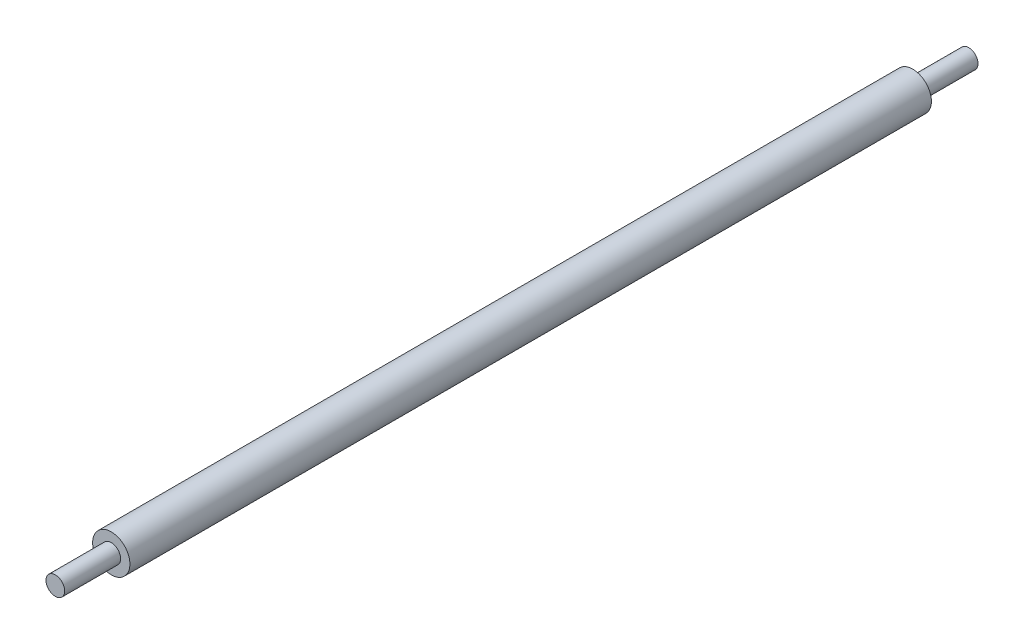
ISO-10303-21;
HEADER;
FILE_DESCRIPTION(('STEP AP214'),'2;1');
FILE_NAME('part.step','',(''),(''),'','','');
FILE_SCHEMA(('AUTOMOTIVE_DESIGN { 1 0 10303 214 1 1 1 1 }'));
ENDSEC;
DATA;
#1=APPLICATION_CONTEXT('core data for automotive mechanical design processes');
#2=APPLICATION_PROTOCOL_DEFINITION('international standard','automotive_design',2000,#1);
#3=PRODUCT_CONTEXT('',#1,'mechanical');
#4=PRODUCT('Part','Part','',(#3));
#5=PRODUCT_RELATED_PRODUCT_CATEGORY('part','',(#4));
#6=PRODUCT_DEFINITION_FORMATION('','',#4);
#7=PRODUCT_DEFINITION_CONTEXT('part definition',#1,'design');
#8=PRODUCT_DEFINITION('design','',#6,#7);
#9=PRODUCT_DEFINITION_SHAPE('','',#8);
#10=(LENGTH_UNIT() NAMED_UNIT(*) SI_UNIT(.MILLI.,.METRE.));
#11=(NAMED_UNIT(*) PLANE_ANGLE_UNIT() SI_UNIT($,.RADIAN.));
#12=(NAMED_UNIT(*) SI_UNIT($,.STERADIAN.) SOLID_ANGLE_UNIT());
#13=UNCERTAINTY_MEASURE_WITH_UNIT(LENGTH_MEASURE(1.E-05),#10,'distance_accuracy_value','');
#14=(GEOMETRIC_REPRESENTATION_CONTEXT(3) GLOBAL_UNCERTAINTY_ASSIGNED_CONTEXT((#13)) GLOBAL_UNIT_ASSIGNED_CONTEXT((#10,
#11,#12)) REPRESENTATION_CONTEXT('',''));
#15=CARTESIAN_POINT('',(0.,0.,0.));
#16=DIRECTION('',(0.,0.,1.));
#17=DIRECTION('',(1.,0.,0.));
#18=AXIS2_PLACEMENT_3D('',#15,#16,#17);
#19=CARTESIAN_POINT('',(0.,0.,622.3));
#20=DIRECTION('',(0.,0.,-1.));
#21=DIRECTION('',(-1.,0.,0.));
#22=AXIS2_PLACEMENT_3D('',#19,#20,#21);
#23=CYLINDRICAL_SURFACE('',#22,12.7);
#24=CARTESIAN_POINT('',(0.,0.,38.1));
#25=DIRECTION('',(0.,0.,1.));
#26=DIRECTION('',(1.,0.,0.));
#27=AXIS2_PLACEMENT_3D('',#24,#25,#26);
#28=CIRCLE('',#27,12.7);
#29=CARTESIAN_POINT('',(12.7,0.,38.1));
#30=VERTEX_POINT('',#29);
#31=EDGE_CURVE('E12',#30,#30,#28,.T.);
#32=ORIENTED_EDGE('',*,*,#31,.T.);
#33=EDGE_LOOP('',(#32));
#34=FACE_BOUND('',#33,.T.);
#35=CARTESIAN_POINT('',(0.,0.,584.2));
#36=DIRECTION('',(0.,0.,1.));
#37=DIRECTION('',(1.,0.,0.));
#38=AXIS2_PLACEMENT_3D('',#35,#36,#37);
#39=CIRCLE('',#38,12.7);
#40=CARTESIAN_POINT('',(12.7,0.,584.2));
#41=VERTEX_POINT('',#40);
#42=EDGE_CURVE('E51',#41,#41,#39,.T.);
#43=ORIENTED_EDGE('',*,*,#42,.F.);
#44=EDGE_LOOP('',(#43));
#45=FACE_BOUND('',#44,.T.);
#46=ADVANCED_FACE('F48',(#34,#45),#23,.T.);
#47=CARTESIAN_POINT('',(0.,0.,38.1));
#48=DIRECTION('',(0.,0.,1.));
#49=DIRECTION('',(1.,0.,0.));
#50=AXIS2_PLACEMENT_3D('',#47,#48,#49);
#51=PLANE('',#50);
#52=CARTESIAN_POINT('',(0.,0.,38.1));
#53=DIRECTION('',(0.,0.,1.));
#54=DIRECTION('',(1.,0.,0.));
#55=AXIS2_PLACEMENT_3D('',#52,#53,#54);
#56=CIRCLE('',#55,6.36193552466987);
#57=CARTESIAN_POINT('',(-6.36193552466987,0.,38.1));
#58=VERTEX_POINT('',#57);
#59=EDGE_CURVE('E55',#58,#58,#56,.T.);
#60=ORIENTED_EDGE('',*,*,#59,.T.);
#61=EDGE_LOOP('',(#60));
#62=FACE_BOUND('',#61,.T.);
#63=ORIENTED_EDGE('',*,*,#31,.F.);
#64=EDGE_LOOP('',(#63));
#65=FACE_BOUND('',#64,.T.);
#66=ADVANCED_FACE('F77',(#62,#65),#51,.F.);
#67=CARTESIAN_POINT('',(0.,0.,38.1));
#68=DIRECTION('',(0.,0.,-1.));
#69=DIRECTION('',(-1.,0.,0.));
#70=AXIS2_PLACEMENT_3D('',#67,#68,#69);
#71=CYLINDRICAL_SURFACE('',#70,6.36193552466987);
#72=CARTESIAN_POINT('',(0.,0.,0.));
#73=DIRECTION('',(0.,0.,1.));
#74=DIRECTION('',(1.,0.,0.));
#75=AXIS2_PLACEMENT_3D('',#72,#73,#74);
#76=CIRCLE('',#75,6.36193552466987);
#77=CARTESIAN_POINT('',(-6.36193552466987,0.,0.));
#78=VERTEX_POINT('',#77);
#79=EDGE_CURVE('E59',#78,#78,#76,.T.);
#80=CARTESIAN_POINT('',(-6.36193552466987,0.,38.1));
#81=CARTESIAN_POINT('',(-6.36193552466987,0.,37.703125));
#82=CARTESIAN_POINT('',(-6.36193552466987,0.,37.30625));
#83=CARTESIAN_POINT('',(-6.36193552466987,0.,36.5125));
#84=CARTESIAN_POINT('',(-6.36193552466987,0.,36.115625));
#85=CARTESIAN_POINT('',(-6.36193552466987,0.,35.321875));
#86=CARTESIAN_POINT('',(-6.36193552466987,0.,34.925));
#87=CARTESIAN_POINT('',(-6.36193552466987,0.,34.13125));
#88=CARTESIAN_POINT('',(-6.36193552466987,0.,33.734375));
#89=CARTESIAN_POINT('',(-6.36193552466987,0.,32.940625));
#90=CARTESIAN_POINT('',(-6.36193552466987,0.,32.54375));
#91=CARTESIAN_POINT('',(-6.36193552466987,0.,31.75));
#92=CARTESIAN_POINT('',(-6.36193552466987,0.,31.353125));
#93=CARTESIAN_POINT('',(-6.36193552466987,0.,30.559375));
#94=CARTESIAN_POINT('',(-6.36193552466987,0.,30.1625));
#95=CARTESIAN_POINT('',(-6.36193552466987,0.,29.36875));
#96=CARTESIAN_POINT('',(-6.36193552466987,0.,28.971875));
#97=CARTESIAN_POINT('',(-6.36193552466987,0.,28.178125));
#98=CARTESIAN_POINT('',(-6.36193552466987,0.,27.78125));
#99=CARTESIAN_POINT('',(-6.36193552466987,0.,26.9875));
#100=CARTESIAN_POINT('',(-6.36193552466987,0.,26.590625));
#101=CARTESIAN_POINT('',(-6.36193552466987,0.,25.796875));
#102=CARTESIAN_POINT('',(-6.36193552466987,0.,25.4));
#103=CARTESIAN_POINT('',(-6.36193552466987,0.,24.60625));
#104=CARTESIAN_POINT('',(-6.36193552466987,0.,24.209375));
#105=CARTESIAN_POINT('',(-6.36193552466987,0.,23.415625));
#106=CARTESIAN_POINT('',(-6.36193552466987,0.,23.01875));
#107=CARTESIAN_POINT('',(-6.36193552466987,0.,22.225));
#108=CARTESIAN_POINT('',(-6.36193552466987,0.,21.828125));
#109=CARTESIAN_POINT('',(-6.36193552466987,0.,21.034375));
#110=CARTESIAN_POINT('',(-6.36193552466987,0.,20.6375));
#111=CARTESIAN_POINT('',(-6.36193552466987,0.,19.84375));
#112=CARTESIAN_POINT('',(-6.36193552466987,0.,19.446875));
#113=CARTESIAN_POINT('',(-6.36193552466987,0.,18.653125));
#114=CARTESIAN_POINT('',(-6.36193552466987,0.,18.25625));
#115=CARTESIAN_POINT('',(-6.36193552466987,0.,17.4625));
#116=CARTESIAN_POINT('',(-6.36193552466987,0.,17.065625));
#117=CARTESIAN_POINT('',(-6.36193552466987,0.,16.271875));
#118=CARTESIAN_POINT('',(-6.36193552466987,0.,15.875));
#119=CARTESIAN_POINT('',(-6.36193552466987,0.,15.08125));
#120=CARTESIAN_POINT('',(-6.36193552466987,0.,14.684375));
#121=CARTESIAN_POINT('',(-6.36193552466987,0.,13.890625));
#122=CARTESIAN_POINT('',(-6.36193552466987,0.,13.49375));
#123=CARTESIAN_POINT('',(-6.36193552466987,0.,12.7));
#124=CARTESIAN_POINT('',(-6.36193552466987,0.,12.303125));
#125=CARTESIAN_POINT('',(-6.36193552466987,0.,11.509375));
#126=CARTESIAN_POINT('',(-6.36193552466987,0.,11.1125));
#127=CARTESIAN_POINT('',(-6.36193552466987,0.,10.31875));
#128=CARTESIAN_POINT('',(-6.36193552466987,0.,9.92187499999999));
#129=CARTESIAN_POINT('',(-6.36193552466987,0.,9.128125));
#130=CARTESIAN_POINT('',(-6.36193552466987,0.,8.73124999999999));
#131=CARTESIAN_POINT('',(-6.36193552466987,0.,7.93749999999999));
#132=CARTESIAN_POINT('',(-6.36193552466987,0.,7.54062499999999));
#133=CARTESIAN_POINT('',(-6.36193552466987,0.,6.746875));
#134=CARTESIAN_POINT('',(-6.36193552466987,0.,6.35));
#135=CARTESIAN_POINT('',(-6.36193552466987,0.,5.55625));
#136=CARTESIAN_POINT('',(-6.36193552466987,0.,5.159375));
#137=CARTESIAN_POINT('',(-6.36193552466987,0.,4.365625));
#138=CARTESIAN_POINT('',(-6.36193552466987,0.,3.96875));
#139=CARTESIAN_POINT('',(-6.36193552466987,0.,3.175));
#140=CARTESIAN_POINT('',(-6.36193552466987,0.,2.778125));
#141=CARTESIAN_POINT('',(-6.36193552466987,0.,1.984375));
#142=CARTESIAN_POINT('',(-6.36193552466987,0.,1.5875));
#143=CARTESIAN_POINT('',(-6.36193552466987,0.,0.79375));
#144=CARTESIAN_POINT('',(-6.36193552466987,0.,0.396875));
#145=CARTESIAN_POINT('',(-6.36193552466987,0.,0.));
#146=B_SPLINE_CURVE_WITH_KNOTS('',3,(#80,#81,#82,#83,#84,#85,#86,#87,#88,#89,#90,#91,#92,#93,
#94,#95,#96,#97,#98,#99,#100,#101,#102,#103,#104,#105,#106,#107,#108,#109,#110,#111,#112,#113,
#114,#115,#116,#117,#118,#119,#120,#121,#122,#123,#124,#125,#126,#127,#128,#129,#130,#131,#132,
#133,#134,#135,#136,#137,#138,#139,#140,#141,#142,#143,#144,#145),.UNSPECIFIED.,.F.,.F.,(4,2,2,
2,2,2,2,2,2,2,2,2,2,2,2,2,2,2,2,2,2,2,2,2,2,2,2,2,2,2,2,2,4),(0.,1.190625,2.38125,3.571875,
4.7625,5.953125,7.14375,8.334375,9.52500000000001,10.715625,11.90625,13.096875,14.2875,
15.478125,16.66875,17.859375,19.05,20.240625,21.43125,22.621875,23.8125,25.003125,26.19375,
27.384375,28.575,29.765625,30.95625,32.146875,33.3375,34.528125,35.71875,36.909375,38.1),.UNSPECIFIED.);
#147=EDGE_CURVE('BSEAM81',#58,#78,#146,.T.);
#148=ORIENTED_EDGE('',*,*,#59,.F.);
#149=ORIENTED_EDGE('',*,*,#79,.T.);
#150=ORIENTED_EDGE('',*,*,#147,.T.);
#151=ORIENTED_EDGE('',*,*,#147,.F.);
#152=EDGE_LOOP('',(#148,#150,#149,#151));
#153=FACE_BOUND('',#152,.T.);
#154=ADVANCED_FACE('F81',(#153),#71,.T.);
#155=CARTESIAN_POINT('',(0.,0.,0.));
#156=DIRECTION('',(0.,0.,1.));
#157=DIRECTION('',(1.,0.,0.));
#158=AXIS2_PLACEMENT_3D('',#155,#156,#157);
#159=PLANE('',#158);
#160=ORIENTED_EDGE('',*,*,#79,.F.);
#161=EDGE_LOOP('',(#160));
#162=FACE_BOUND('',#161,.T.);
#163=ADVANCED_FACE('F87',(#162),#159,.F.);
#164=CARTESIAN_POINT('',(0.,0.,584.2));
#165=DIRECTION('',(0.,0.,1.));
#166=DIRECTION('',(1.,0.,0.));
#167=AXIS2_PLACEMENT_3D('',#164,#165,#166);
#168=PLANE('',#167);
#169=CARTESIAN_POINT('',(0.,0.,584.2));
#170=DIRECTION('',(0.,0.,1.));
#171=DIRECTION('',(1.,0.,0.));
#172=AXIS2_PLACEMENT_3D('',#169,#170,#171);
#173=CIRCLE('',#172,6.37790763137687);
#174=CARTESIAN_POINT('',(6.37790763137687,0.,584.2));
#175=VERTEX_POINT('',#174);
#176=EDGE_CURVE('E67',#175,#175,#173,.T.);
#177=ORIENTED_EDGE('',*,*,#176,.F.);
#178=EDGE_LOOP('',(#177));
#179=FACE_BOUND('',#178,.T.);
#180=ORIENTED_EDGE('',*,*,#42,.T.);
#181=EDGE_LOOP('',(#180));
#182=FACE_BOUND('',#181,.T.);
#183=ADVANCED_FACE('F74',(#179,#182),#168,.T.);
#184=CARTESIAN_POINT('',(0.,0.,584.2));
#185=DIRECTION('',(0.,0.,1.));
#186=DIRECTION('',(1.,0.,0.));
#187=AXIS2_PLACEMENT_3D('',#184,#185,#186);
#188=CYLINDRICAL_SURFACE('',#187,6.37790763137687);
#189=CARTESIAN_POINT('',(0.,0.,622.3));
#190=DIRECTION('',(0.,0.,1.));
#191=DIRECTION('',(1.,0.,0.));
#192=AXIS2_PLACEMENT_3D('',#189,#190,#191);
#193=CIRCLE('',#192,6.37790763137687);
#194=CARTESIAN_POINT('',(6.37790763137687,0.,622.3));
#195=VERTEX_POINT('',#194);
#196=EDGE_CURVE('E64',#195,#195,#193,.T.);
#197=CARTESIAN_POINT('',(6.37790763137687,0.,584.2));
#198=CARTESIAN_POINT('',(6.37790763137687,0.,584.596875));
#199=CARTESIAN_POINT('',(6.37790763137687,0.,584.99375));
#200=CARTESIAN_POINT('',(6.37790763137687,0.,585.7875));
#201=CARTESIAN_POINT('',(6.37790763137687,0.,586.184375));
#202=CARTESIAN_POINT('',(6.37790763137687,0.,586.978125));
#203=CARTESIAN_POINT('',(6.37790763137687,0.,587.375));
#204=CARTESIAN_POINT('',(6.37790763137687,0.,588.16875));
#205=CARTESIAN_POINT('',(6.37790763137687,0.,588.565625));
#206=CARTESIAN_POINT('',(6.37790763137687,0.,589.359375));
#207=CARTESIAN_POINT('',(6.37790763137687,0.,589.75625));
#208=CARTESIAN_POINT('',(6.37790763137687,0.,590.55));
#209=CARTESIAN_POINT('',(6.37790763137687,0.,590.946875));
#210=CARTESIAN_POINT('',(6.37790763137687,0.,591.740625));
#211=CARTESIAN_POINT('',(6.37790763137687,0.,592.1375));
#212=CARTESIAN_POINT('',(6.37790763137687,0.,592.93125));
#213=CARTESIAN_POINT('',(6.37790763137687,0.,593.328125));
#214=CARTESIAN_POINT('',(6.37790763137687,0.,594.121875));
#215=CARTESIAN_POINT('',(6.37790763137687,0.,594.51875));
#216=CARTESIAN_POINT('',(6.37790763137687,0.,595.3125));
#217=CARTESIAN_POINT('',(6.37790763137687,0.,595.709375));
#218=CARTESIAN_POINT('',(6.37790763137687,0.,596.503125));
#219=CARTESIAN_POINT('',(6.37790763137687,0.,596.9));
#220=CARTESIAN_POINT('',(6.37790763137687,0.,597.69375));
#221=CARTESIAN_POINT('',(6.37790763137687,0.,598.090625));
#222=CARTESIAN_POINT('',(6.37790763137687,0.,598.884375));
#223=CARTESIAN_POINT('',(6.37790763137687,0.,599.28125));
#224=CARTESIAN_POINT('',(6.37790763137687,0.,600.075));
#225=CARTESIAN_POINT('',(6.37790763137687,0.,600.471875));
#226=CARTESIAN_POINT('',(6.37790763137687,0.,601.265625));
#227=CARTESIAN_POINT('',(6.37790763137687,0.,601.6625));
#228=CARTESIAN_POINT('',(6.37790763137687,0.,602.45625));
#229=CARTESIAN_POINT('',(6.37790763137687,0.,602.853125));
#230=CARTESIAN_POINT('',(6.37790763137687,0.,603.646875));
#231=CARTESIAN_POINT('',(6.37790763137687,0.,604.04375));
#232=CARTESIAN_POINT('',(6.37790763137687,0.,604.8375));
#233=CARTESIAN_POINT('',(6.37790763137687,0.,605.234375));
#234=CARTESIAN_POINT('',(6.37790763137687,0.,606.028125));
#235=CARTESIAN_POINT('',(6.37790763137687,0.,606.425));
#236=CARTESIAN_POINT('',(6.37790763137687,0.,607.21875));
#237=CARTESIAN_POINT('',(6.37790763137687,0.,607.615625));
#238=CARTESIAN_POINT('',(6.37790763137687,0.,608.409375));
#239=CARTESIAN_POINT('',(6.37790763137687,0.,608.80625));
#240=CARTESIAN_POINT('',(6.37790763137687,0.,609.6));
#241=CARTESIAN_POINT('',(6.37790763137687,0.,609.996875));
#242=CARTESIAN_POINT('',(6.37790763137687,0.,610.790625));
#243=CARTESIAN_POINT('',(6.37790763137687,0.,611.1875));
#244=CARTESIAN_POINT('',(6.37790763137687,0.,611.98125));
#245=CARTESIAN_POINT('',(6.37790763137687,0.,612.378125));
#246=CARTESIAN_POINT('',(6.37790763137687,0.,613.171875));
#247=CARTESIAN_POINT('',(6.37790763137687,0.,613.56875));
#248=CARTESIAN_POINT('',(6.37790763137687,0.,614.3625));
#249=CARTESIAN_POINT('',(6.37790763137687,0.,614.759375));
#250=CARTESIAN_POINT('',(6.37790763137687,0.,615.553125));
#251=CARTESIAN_POINT('',(6.37790763137687,0.,615.95));
#252=CARTESIAN_POINT('',(6.37790763137687,0.,616.74375));
#253=CARTESIAN_POINT('',(6.37790763137687,0.,617.140625));
#254=CARTESIAN_POINT('',(6.37790763137687,0.,617.934375));
#255=CARTESIAN_POINT('',(6.37790763137687,0.,618.33125));
#256=CARTESIAN_POINT('',(6.37790763137687,0.,619.125));
#257=CARTESIAN_POINT('',(6.37790763137687,0.,619.521875));
#258=CARTESIAN_POINT('',(6.37790763137687,0.,620.315625));
#259=CARTESIAN_POINT('',(6.37790763137687,0.,620.7125));
#260=CARTESIAN_POINT('',(6.37790763137687,0.,621.50625));
#261=CARTESIAN_POINT('',(6.37790763137687,0.,621.903125));
#262=CARTESIAN_POINT('',(6.37790763137687,0.,622.3));
#263=B_SPLINE_CURVE_WITH_KNOTS('',3,(#197,#198,#199,#200,#201,#202,#203,#204,#205,#206,#207,
#208,#209,#210,#211,#212,#213,#214,#215,#216,#217,#218,#219,#220,#221,#222,#223,#224,#225,#226,
#227,#228,#229,#230,#231,#232,#233,#234,#235,#236,#237,#238,#239,#240,#241,#242,#243,#244,#245,
#246,#247,#248,#249,#250,#251,#252,#253,#254,#255,#256,#257,#258,#259,#260,#261,#262),
.UNSPECIFIED.,.F.,.F.,(4,2,2,2,2,2,2,2,2,2,2,2,2,2,2,2,2,2,2,2,2,2,2,2,2,2,2,2,2,2,2,2,4),(0.,
1.190625,2.38125,3.571875,4.7625,5.953125,7.14375,8.334375,9.52500000000001,10.715625,11.90625,
13.096875,14.2875,15.478125,16.66875,17.859375,19.05,20.240625,21.43125,22.621875,23.8125,
25.003125,26.19375,27.384375,28.575,29.765625,30.95625,32.146875,33.3375,34.528125,35.71875,
36.909375,38.1),.UNSPECIFIED.);
#264=EDGE_CURVE('BSEAM95',#175,#195,#263,.T.);
#265=ORIENTED_EDGE('',*,*,#176,.T.);
#266=ORIENTED_EDGE('',*,*,#196,.F.);
#267=ORIENTED_EDGE('',*,*,#264,.T.);
#268=ORIENTED_EDGE('',*,*,#264,.F.);
#269=EDGE_LOOP('',(#265,#267,#266,#268));
#270=FACE_BOUND('',#269,.T.);
#271=ADVANCED_FACE('F95',(#270),#188,.T.);
#272=CARTESIAN_POINT('',(0.,0.,622.3));
#273=DIRECTION('',(0.,0.,1.));
#274=DIRECTION('',(1.,0.,0.));
#275=AXIS2_PLACEMENT_3D('',#272,#273,#274);
#276=PLANE('',#275);
#277=ORIENTED_EDGE('',*,*,#196,.T.);
#278=EDGE_LOOP('',(#277));
#279=FACE_BOUND('',#278,.T.);
#280=ADVANCED_FACE('F93',(#279),#276,.T.);
#281=CLOSED_SHELL('',(#46,#66,#154,#163,#183,#271,#280));
#282=MANIFOLD_SOLID_BREP('B2',#281);
#283=ADVANCED_BREP_SHAPE_REPRESENTATION('',(#18,#282),#14);
#284=SHAPE_DEFINITION_REPRESENTATION(#9,#283);
ENDSEC;
END-ISO-10303-21;
